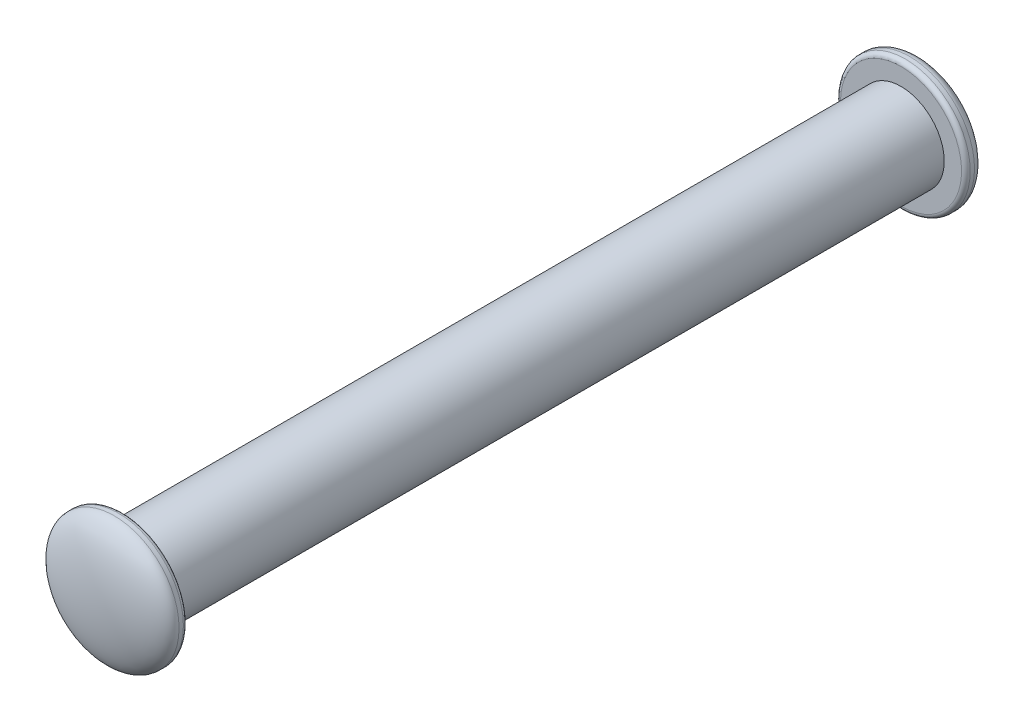
ISO-10303-21;
HEADER;
FILE_DESCRIPTION(('STEP AP214'),'2;1');
FILE_NAME('part.step','',(''),(''),'','','');
FILE_SCHEMA(('AUTOMOTIVE_DESIGN { 1 0 10303 214 1 1 1 1 }'));
ENDSEC;
DATA;
#1=APPLICATION_CONTEXT('core data for automotive mechanical design processes');
#2=APPLICATION_PROTOCOL_DEFINITION('international standard','automotive_design',2000,#1);
#3=PRODUCT_CONTEXT('',#1,'mechanical');
#4=PRODUCT('Part','Part','',(#3));
#5=PRODUCT_RELATED_PRODUCT_CATEGORY('part','',(#4));
#6=PRODUCT_DEFINITION_FORMATION('','',#4);
#7=PRODUCT_DEFINITION_CONTEXT('part definition',#1,'design');
#8=PRODUCT_DEFINITION('design','',#6,#7);
#9=PRODUCT_DEFINITION_SHAPE('','',#8);
#10=(LENGTH_UNIT() NAMED_UNIT(*) SI_UNIT(.MILLI.,.METRE.));
#11=(NAMED_UNIT(*) PLANE_ANGLE_UNIT() SI_UNIT($,.RADIAN.));
#12=(NAMED_UNIT(*) SI_UNIT($,.STERADIAN.) SOLID_ANGLE_UNIT());
#13=UNCERTAINTY_MEASURE_WITH_UNIT(LENGTH_MEASURE(1.E-05),#10,'distance_accuracy_value','');
#14=(GEOMETRIC_REPRESENTATION_CONTEXT(3) GLOBAL_UNCERTAINTY_ASSIGNED_CONTEXT((#13)) GLOBAL_UNIT_ASSIGNED_CONTEXT((#10,
#11,#12)) REPRESENTATION_CONTEXT('',''));
#15=CARTESIAN_POINT('',(0.,0.,0.));
#16=DIRECTION('',(0.,0.,1.));
#17=DIRECTION('',(1.,0.,0.));
#18=AXIS2_PLACEMENT_3D('',#15,#16,#17);
#19=CARTESIAN_POINT('',(0.,0.,4.5));
#20=DIRECTION('',(0.,0.,-1.));
#21=DIRECTION('',(-1.,0.,0.));
#22=AXIS2_PLACEMENT_3D('',#19,#20,#21);
#23=CYLINDRICAL_SURFACE('',#22,0.5);
#24=CARTESIAN_POINT('',(0.,0.,4.5));
#25=DIRECTION('',(0.,0.,1.));
#26=DIRECTION('',(1.,0.,0.));
#27=AXIS2_PLACEMENT_3D('',#24,#25,#26);
#28=CIRCLE('',#27,0.5);
#29=CARTESIAN_POINT('',(0.5,0.,4.5));
#30=VERTEX_POINT('',#29);
#31=EDGE_CURVE('E62',#30,#30,#28,.T.);
#32=ORIENTED_EDGE('',*,*,#31,.F.);
#33=EDGE_LOOP('',(#32));
#34=FACE_BOUND('',#33,.T.);
#35=CARTESIAN_POINT('',(0.,0.,-4.5));
#36=DIRECTION('',(0.,0.,-1.));
#37=DIRECTION('',(-1.,0.,0.));
#38=AXIS2_PLACEMENT_3D('',#35,#36,#37);
#39=CIRCLE('',#38,0.5);
#40=CARTESIAN_POINT('',(-0.5,0.,-4.5));
#41=VERTEX_POINT('',#40);
#42=EDGE_CURVE('E63',#41,#41,#39,.T.);
#43=ORIENTED_EDGE('',*,*,#42,.F.);
#44=EDGE_LOOP('',(#43));
#45=FACE_BOUND('',#44,.T.);
#46=ADVANCED_FACE('F37',(#34,#45),#23,.T.);
#47=CARTESIAN_POINT('',(0.,0.,4.5));
#48=DIRECTION('',(0.,0.,1.));
#49=DIRECTION('',(1.,0.,0.));
#50=AXIS2_PLACEMENT_3D('',#47,#48,#49);
#51=PLANE('',#50);
#52=CARTESIAN_POINT('',(0.,0.,4.5));
#53=DIRECTION('',(0.,0.,1.));
#54=DIRECTION('',(1.,0.,0.));
#55=AXIS2_PLACEMENT_3D('',#52,#53,#54);
#56=CIRCLE('',#55,0.7);
#57=CARTESIAN_POINT('',(0.7,0.,4.5));
#58=VERTEX_POINT('',#57);
#59=EDGE_CURVE('E90',#58,#58,#56,.F.);
#60=ORIENTED_EDGE('',*,*,#59,.T.);
#61=EDGE_LOOP('',(#60));
#62=FACE_BOUND('',#61,.T.);
#63=ORIENTED_EDGE('',*,*,#31,.T.);
#64=EDGE_LOOP('',(#63));
#65=FACE_BOUND('',#64,.T.);
#66=ADVANCED_FACE('F102',(#62,#65),#51,.F.);
#67=CARTESIAN_POINT('',(0.,0.,4.6));
#68=DIRECTION('',(0.,0.,-1.));
#69=DIRECTION('',(-1.,0.,0.));
#70=AXIS2_PLACEMENT_3D('',#67,#68,#69);
#71=CYLINDRICAL_SURFACE('',#70,0.75);
#72=CARTESIAN_POINT('',(0.,0.,4.55));
#73=DIRECTION('',(0.,0.,1.));
#74=DIRECTION('',(1.,0.,0.));
#75=AXIS2_PLACEMENT_3D('',#72,#73,#74);
#76=CIRCLE('',#75,0.75);
#77=CARTESIAN_POINT('',(0.75,0.,4.55));
#78=VERTEX_POINT('',#77);
#79=EDGE_CURVE('E68',#78,#78,#76,.T.);
#80=ORIENTED_EDGE('',*,*,#79,.T.);
#81=EDGE_LOOP('',(#80));
#82=FACE_BOUND('',#81,.T.);
#83=CARTESIAN_POINT('',(0.,0.,4.6));
#84=DIRECTION('',(0.,0.,1.));
#85=DIRECTION('',(1.,0.,0.));
#86=AXIS2_PLACEMENT_3D('',#83,#84,#85);
#87=CIRCLE('',#86,0.75);
#88=CARTESIAN_POINT('',(0.75,0.,4.6));
#89=VERTEX_POINT('',#88);
#90=EDGE_CURVE('E59',#89,#89,#87,.T.);
#91=ORIENTED_EDGE('',*,*,#90,.F.);
#92=EDGE_LOOP('',(#91));
#93=FACE_BOUND('',#92,.T.);
#94=ADVANCED_FACE('F55',(#82,#93),#71,.T.);
#95=CARTESIAN_POINT('',(0.,0.,4.6));
#96=DIRECTION('',(0.,1.,0.));
#97=DIRECTION('',(1.,0.,0.));
#98=AXIS2_PLACEMENT_3D('',#95,#96,#97);
#99=ELLIPSE('',#98,0.75,0.25);
#100=TRIMMED_CURVE('',#99,(PARAMETER_VALUE(4.71238898038469)),
(PARAMETER_VALUE(7.85398163397448)),.T.,.PARAMETER.);
#101=CARTESIAN_POINT('',(0.,0.,4.35));
#102=DIRECTION('',(0.,0.,1.));
#103=AXIS1_PLACEMENT('',#101,#102);
#104=SURFACE_OF_REVOLUTION('',#100,#103);
#105=CARTESIAN_POINT('',(0.,0.,4.85));
#106=VERTEX_POINT('',#105);
#107=VERTEX_LOOP('',#106);
#108=FACE_BOUND('',#107,.T.);
#109=ORIENTED_EDGE('',*,*,#90,.T.);
#110=EDGE_LOOP('',(#109));
#111=FACE_BOUND('',#110,.T.);
#112=ADVANCED_FACE('F51',(#108,#111),#104,.F.);
#113=CARTESIAN_POINT('',(0.,0.,4.55));
#114=DIRECTION('',(0.,0.,1.));
#115=DIRECTION('',(1.,0.,0.));
#116=AXIS2_PLACEMENT_3D('',#113,#114,#115);
#117=TOROIDAL_SURFACE('',#116,0.7,0.05);
#118=ORIENTED_EDGE('',*,*,#59,.F.);
#119=EDGE_LOOP('',(#118));
#120=FACE_BOUND('',#119,.T.);
#121=ORIENTED_EDGE('',*,*,#79,.F.);
#122=EDGE_LOOP('',(#121));
#123=FACE_BOUND('',#122,.T.);
#124=ADVANCED_FACE('F54',(#120,#123),#117,.T.);
#125=CARTESIAN_POINT('',(0.,0.,-4.5));
#126=DIRECTION('',(0.,0.,-1.));
#127=DIRECTION('',(1.,0.,0.));
#128=AXIS2_PLACEMENT_3D('',#125,#126,#127);
#129=PLANE('',#128);
#130=CARTESIAN_POINT('',(0.,0.,-4.5));
#131=DIRECTION('',(0.,0.,-1.));
#132=DIRECTION('',(-1.,0.,0.));
#133=AXIS2_PLACEMENT_3D('',#130,#131,#132);
#134=CIRCLE('',#133,0.7);
#135=CARTESIAN_POINT('',(-0.7,0.,-4.5));
#136=VERTEX_POINT('',#135);
#137=EDGE_CURVE('E45',#136,#136,#134,.F.);
#138=ORIENTED_EDGE('',*,*,#137,.T.);
#139=EDGE_LOOP('',(#138));
#140=FACE_BOUND('',#139,.T.);
#141=ORIENTED_EDGE('',*,*,#42,.T.);
#142=EDGE_LOOP('',(#141));
#143=FACE_BOUND('',#142,.T.);
#144=ADVANCED_FACE('F81',(#140,#143),#129,.F.);
#145=CARTESIAN_POINT('',(0.,0.,-4.6));
#146=DIRECTION('',(0.,0.,1.));
#147=DIRECTION('',(1.,0.,0.));
#148=AXIS2_PLACEMENT_3D('',#145,#146,#147);
#149=CYLINDRICAL_SURFACE('',#148,0.75);
#150=CARTESIAN_POINT('',(0.,0.,-4.55));
#151=DIRECTION('',(0.,0.,-1.));
#152=DIRECTION('',(-1.,0.,0.));
#153=AXIS2_PLACEMENT_3D('',#150,#151,#152);
#154=CIRCLE('',#153,0.75);
#155=CARTESIAN_POINT('',(-0.75,0.,-4.55));
#156=VERTEX_POINT('',#155);
#157=EDGE_CURVE('E11',#156,#156,#154,.T.);
#158=ORIENTED_EDGE('',*,*,#157,.T.);
#159=EDGE_LOOP('',(#158));
#160=FACE_BOUND('',#159,.T.);
#161=CARTESIAN_POINT('',(0.,0.,-4.6));
#162=DIRECTION('',(0.,0.,1.));
#163=DIRECTION('',(1.,0.,0.));
#164=AXIS2_PLACEMENT_3D('',#161,#162,#163);
#165=CIRCLE('',#164,0.75);
#166=CARTESIAN_POINT('',(0.75,0.,-4.6));
#167=VERTEX_POINT('',#166);
#168=EDGE_CURVE('E71',#167,#167,#165,.T.);
#169=ORIENTED_EDGE('',*,*,#168,.T.);
#170=EDGE_LOOP('',(#169));
#171=FACE_BOUND('',#170,.T.);
#172=ADVANCED_FACE('F86',(#160,#171),#149,.T.);
#173=CARTESIAN_POINT('',(0.,0.,-4.6));
#174=DIRECTION('',(0.,-1.,0.));
#175=DIRECTION('',(1.,0.,0.));
#176=AXIS2_PLACEMENT_3D('',#173,#174,#175);
#177=ELLIPSE('',#176,0.75,0.25);
#178=TRIMMED_CURVE('',#177,(PARAMETER_VALUE(4.71238898038469)),
(PARAMETER_VALUE(7.85398163397448)),.T.,.PARAMETER.);
#179=CARTESIAN_POINT('',(0.,0.,-4.35));
#180=DIRECTION('',(0.,0.,-1.));
#181=AXIS1_PLACEMENT('',#179,#180);
#182=SURFACE_OF_REVOLUTION('',#178,#181);
#183=CARTESIAN_POINT('',(0.,0.,-4.85));
#184=VERTEX_POINT('',#183);
#185=VERTEX_LOOP('',#184);
#186=FACE_BOUND('',#185,.T.);
#187=ORIENTED_EDGE('',*,*,#168,.F.);
#188=EDGE_LOOP('',(#187));
#189=FACE_BOUND('',#188,.T.);
#190=ADVANCED_FACE('F83',(#186,#189),#182,.F.);
#191=CARTESIAN_POINT('',(0.,0.,-4.55));
#192=DIRECTION('',(0.,0.,-1.));
#193=DIRECTION('',(-1.,0.,0.));
#194=AXIS2_PLACEMENT_3D('',#191,#192,#193);
#195=TOROIDAL_SURFACE('',#194,0.7,0.05);
#196=ORIENTED_EDGE('',*,*,#157,.F.);
#197=EDGE_LOOP('',(#196));
#198=FACE_BOUND('',#197,.T.);
#199=ORIENTED_EDGE('',*,*,#137,.F.);
#200=EDGE_LOOP('',(#199));
#201=FACE_BOUND('',#200,.T.);
#202=ADVANCED_FACE('F39',(#198,#201),#195,.T.);
#203=CLOSED_SHELL('',(#46,#66,#94,#112,#124,#144,#172,#190,#202));
#204=MANIFOLD_SOLID_BREP('B2',#203);
#205=ADVANCED_BREP_SHAPE_REPRESENTATION('',(#18,#204),#14);
#206=SHAPE_DEFINITION_REPRESENTATION(#9,#205);
ENDSEC;
END-ISO-10303-21;
